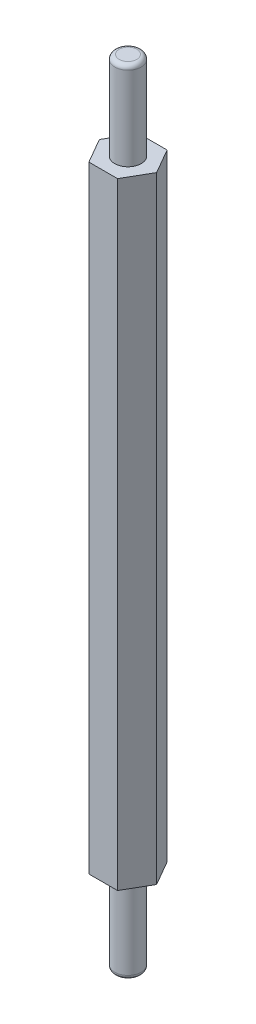
ISO-10303-21;
HEADER;
FILE_DESCRIPTION(('STEP AP214'),'2;1');
FILE_NAME('part.step','',(''),(''),'','','');
FILE_SCHEMA(('AUTOMOTIVE_DESIGN { 1 0 10303 214 1 1 1 1 }'));
ENDSEC;
DATA;
#1=APPLICATION_CONTEXT('core data for automotive mechanical design processes');
#2=APPLICATION_PROTOCOL_DEFINITION('international standard','automotive_design',2000,#1);
#3=PRODUCT_CONTEXT('',#1,'mechanical');
#4=PRODUCT('Part','Part','',(#3));
#5=PRODUCT_RELATED_PRODUCT_CATEGORY('part','',(#4));
#6=PRODUCT_DEFINITION_FORMATION('','',#4);
#7=PRODUCT_DEFINITION_CONTEXT('part definition',#1,'design');
#8=PRODUCT_DEFINITION('design','',#6,#7);
#9=PRODUCT_DEFINITION_SHAPE('','',#8);
#10=(LENGTH_UNIT() NAMED_UNIT(*) SI_UNIT(.MILLI.,.METRE.));
#11=(NAMED_UNIT(*) PLANE_ANGLE_UNIT() SI_UNIT($,.RADIAN.));
#12=(NAMED_UNIT(*) SI_UNIT($,.STERADIAN.) SOLID_ANGLE_UNIT());
#13=UNCERTAINTY_MEASURE_WITH_UNIT(LENGTH_MEASURE(1.E-05),#10,'distance_accuracy_value','');
#14=(GEOMETRIC_REPRESENTATION_CONTEXT(3) GLOBAL_UNCERTAINTY_ASSIGNED_CONTEXT((#13)) GLOBAL_UNIT_ASSIGNED_CONTEXT((#10,
#11,#12)) REPRESENTATION_CONTEXT('',''));
#15=CARTESIAN_POINT('',(0.,0.,0.));
#16=DIRECTION('',(0.,0.,1.));
#17=DIRECTION('',(1.,0.,0.));
#18=AXIS2_PLACEMENT_3D('',#15,#16,#17);
#19=CARTESIAN_POINT('',(0.,90.,0.));
#20=DIRECTION('',(0.,-1.,0.));
#21=DIRECTION('',(0.,0.,-1.));
#22=AXIS2_PLACEMENT_3D('',#19,#20,#21);
#23=CYLINDRICAL_SURFACE('',#22,1.5);
#24=CARTESIAN_POINT('',(0.,80.,0.));
#25=DIRECTION('',(0.,1.,0.));
#26=DIRECTION('',(0.,0.,1.));
#27=AXIS2_PLACEMENT_3D('',#24,#25,#26);
#28=CIRCLE('',#27,1.5);
#29=CARTESIAN_POINT('',(0.,80.,-1.5));
#30=VERTEX_POINT('',#29);
#31=EDGE_CURVE('E142',#30,#30,#28,.T.);
#32=CARTESIAN_POINT('',(0.,89.5,0.));
#33=DIRECTION('',(0.,1.,0.));
#34=DIRECTION('',(0.,0.,1.));
#35=AXIS2_PLACEMENT_3D('',#32,#33,#34);
#36=CIRCLE('',#35,1.5);
#37=CARTESIAN_POINT('',(0.,89.5,-1.5));
#38=VERTEX_POINT('',#37);
#39=EDGE_CURVE('E118',#38,#38,#36,.F.);
#40=CARTESIAN_POINT('',(0.,80.,-1.5));
#41=CARTESIAN_POINT('',(0.,80.0989583333333,-1.5));
#42=CARTESIAN_POINT('',(0.,80.1979166666667,-1.5));
#43=CARTESIAN_POINT('',(0.,80.3958333333333,-1.5));
#44=CARTESIAN_POINT('',(0.,80.4947916666667,-1.5));
#45=CARTESIAN_POINT('',(0.,80.6927083333333,-1.5));
#46=CARTESIAN_POINT('',(0.,80.7916666666667,-1.5));
#47=CARTESIAN_POINT('',(0.,80.9895833333333,-1.5));
#48=CARTESIAN_POINT('',(0.,81.0885416666667,-1.5));
#49=CARTESIAN_POINT('',(0.,81.2864583333333,-1.5));
#50=CARTESIAN_POINT('',(0.,81.3854166666667,-1.5));
#51=CARTESIAN_POINT('',(0.,81.5833333333333,-1.5));
#52=CARTESIAN_POINT('',(0.,81.6822916666667,-1.5));
#53=CARTESIAN_POINT('',(0.,81.8802083333333,-1.5));
#54=CARTESIAN_POINT('',(0.,81.9791666666667,-1.5));
#55=CARTESIAN_POINT('',(0.,82.1770833333333,-1.5));
#56=CARTESIAN_POINT('',(0.,82.2760416666667,-1.5));
#57=CARTESIAN_POINT('',(0.,82.4739583333333,-1.5));
#58=CARTESIAN_POINT('',(0.,82.5729166666667,-1.5));
#59=CARTESIAN_POINT('',(0.,82.7708333333333,-1.5));
#60=CARTESIAN_POINT('',(0.,82.8697916666667,-1.5));
#61=CARTESIAN_POINT('',(0.,83.0677083333333,-1.5));
#62=CARTESIAN_POINT('',(0.,83.1666666666667,-1.5));
#63=CARTESIAN_POINT('',(0.,83.3645833333333,-1.5));
#64=CARTESIAN_POINT('',(0.,83.4635416666667,-1.5));
#65=CARTESIAN_POINT('',(0.,83.6614583333333,-1.5));
#66=CARTESIAN_POINT('',(0.,83.7604166666667,-1.5));
#67=CARTESIAN_POINT('',(0.,83.9583333333333,-1.5));
#68=CARTESIAN_POINT('',(0.,84.0572916666667,-1.5));
#69=CARTESIAN_POINT('',(0.,84.2552083333333,-1.5));
#70=CARTESIAN_POINT('',(0.,84.3541666666667,-1.5));
#71=CARTESIAN_POINT('',(0.,84.5520833333333,-1.5));
#72=CARTESIAN_POINT('',(0.,84.6510416666667,-1.5));
#73=CARTESIAN_POINT('',(0.,84.8489583333333,-1.5));
#74=CARTESIAN_POINT('',(0.,84.9479166666667,-1.5));
#75=CARTESIAN_POINT('',(0.,85.1458333333333,-1.5));
#76=CARTESIAN_POINT('',(0.,85.2447916666667,-1.5));
#77=CARTESIAN_POINT('',(0.,85.4427083333333,-1.5));
#78=CARTESIAN_POINT('',(0.,85.5416666666667,-1.5));
#79=CARTESIAN_POINT('',(0.,85.7395833333333,-1.5));
#80=CARTESIAN_POINT('',(0.,85.8385416666667,-1.5));
#81=CARTESIAN_POINT('',(0.,86.0364583333333,-1.5));
#82=CARTESIAN_POINT('',(0.,86.1354166666667,-1.5));
#83=CARTESIAN_POINT('',(0.,86.3333333333333,-1.5));
#84=CARTESIAN_POINT('',(0.,86.4322916666667,-1.5));
#85=CARTESIAN_POINT('',(0.,86.6302083333333,-1.5));
#86=CARTESIAN_POINT('',(0.,86.7291666666667,-1.5));
#87=CARTESIAN_POINT('',(0.,86.9270833333333,-1.5));
#88=CARTESIAN_POINT('',(0.,87.0260416666667,-1.5));
#89=CARTESIAN_POINT('',(0.,87.2239583333333,-1.5));
#90=CARTESIAN_POINT('',(0.,87.3229166666667,-1.5));
#91=CARTESIAN_POINT('',(0.,87.5208333333333,-1.5));
#92=CARTESIAN_POINT('',(0.,87.6197916666667,-1.5));
#93=CARTESIAN_POINT('',(0.,87.8177083333333,-1.5));
#94=CARTESIAN_POINT('',(0.,87.9166666666667,-1.5));
#95=CARTESIAN_POINT('',(0.,88.1145833333333,-1.5));
#96=CARTESIAN_POINT('',(0.,88.2135416666667,-1.5));
#97=CARTESIAN_POINT('',(0.,88.4114583333333,-1.5));
#98=CARTESIAN_POINT('',(0.,88.5104166666667,-1.5));
#99=CARTESIAN_POINT('',(0.,88.7083333333333,-1.5));
#100=CARTESIAN_POINT('',(0.,88.8072916666667,-1.5));
#101=CARTESIAN_POINT('',(0.,89.0052083333333,-1.5));
#102=CARTESIAN_POINT('',(0.,89.1041666666667,-1.5));
#103=CARTESIAN_POINT('',(0.,89.3020833333333,-1.5));
#104=CARTESIAN_POINT('',(0.,89.4010416666667,-1.5));
#105=CARTESIAN_POINT('',(0.,89.5,-1.5));
#106=B_SPLINE_CURVE_WITH_KNOTS('',3,(#40,#41,#42,#43,#44,#45,#46,#47,#48,#49,#50,#51,#52,#53,
#54,#55,#56,#57,#58,#59,#60,#61,#62,#63,#64,#65,#66,#67,#68,#69,#70,#71,#72,#73,#74,#75,#76,#77,
#78,#79,#80,#81,#82,#83,#84,#85,#86,#87,#88,#89,#90,#91,#92,#93,#94,#95,#96,#97,#98,#99,#100,
#101,#102,#103,#104,#105),.UNSPECIFIED.,.F.,.F.,(4,2,2,2,2,2,2,2,2,2,2,2,2,2,2,2,2,2,2,2,2,2,2,
2,2,2,2,2,2,2,2,2,4),(0.,0.296874999999988,0.59374999999999,0.890624999999992,1.18749999999999,
1.484375,1.78125,2.078125,2.37499999999999,2.67187499999999,2.96874999999999,3.26562499999999,
3.5625,3.859375,4.15624999999999,4.45312499999999,4.74999999999999,5.04687499999999,
5.34374999999999,5.640625,5.93749999999998,6.23437499999999,6.53124999999999,6.82812499999999,
7.12499999999999,7.42187499999999,7.71874999999998,8.01562499999998,8.31249999999999,
8.60937499999999,8.90624999999999,9.20312499999999,9.49999999999999),.UNSPECIFIED.);
#107=EDGE_CURVE('BSEAM41',#30,#38,#106,.T.);
#108=ORIENTED_EDGE('',*,*,#31,.T.);
#109=ORIENTED_EDGE('',*,*,#39,.T.);
#110=ORIENTED_EDGE('',*,*,#107,.T.);
#111=ORIENTED_EDGE('',*,*,#107,.F.);
#112=EDGE_LOOP('',(#108,#110,#109,#111));
#113=FACE_BOUND('',#112,.T.);
#114=ADVANCED_FACE('F41',(#113),#23,.T.);
#115=CARTESIAN_POINT('',(0.,90.,0.));
#116=DIRECTION('',(0.,1.,0.));
#117=DIRECTION('',(0.,0.,1.));
#118=AXIS2_PLACEMENT_3D('',#115,#116,#117);
#119=PLANE('',#118);
#120=CARTESIAN_POINT('',(0.,90.,0.));
#121=DIRECTION('',(0.,1.,0.));
#122=DIRECTION('',(0.,0.,1.));
#123=AXIS2_PLACEMENT_3D('',#120,#121,#122);
#124=CIRCLE('',#123,1.);
#125=CARTESIAN_POINT('',(0.,90.,1.));
#126=VERTEX_POINT('',#125);
#127=EDGE_CURVE('E11',#126,#126,#124,.T.);
#128=ORIENTED_EDGE('',*,*,#127,.T.);
#129=EDGE_LOOP('',(#128));
#130=FACE_BOUND('',#129,.T.);
#131=ADVANCED_FACE('F210',(#130),#119,.T.);
#132=CARTESIAN_POINT('',(0.,89.5,0.));
#133=DIRECTION('',(0.,1.,0.));
#134=DIRECTION('',(0.,0.,1.));
#135=AXIS2_PLACEMENT_3D('',#132,#133,#134);
#136=TOROIDAL_SURFACE('',#135,1.,0.5);
#137=ORIENTED_EDGE('',*,*,#39,.F.);
#138=EDGE_LOOP('',(#137));
#139=FACE_BOUND('',#138,.T.);
#140=ORIENTED_EDGE('',*,*,#127,.F.);
#141=EDGE_LOOP('',(#140));
#142=FACE_BOUND('',#141,.T.);
#143=ADVANCED_FACE('F43',(#139,#142),#136,.T.);
#144=CARTESIAN_POINT('',(0.,80.,0.));
#145=DIRECTION('',(0.,1.,0.));
#146=DIRECTION('',(0.,0.,1.));
#147=AXIS2_PLACEMENT_3D('',#144,#145,#146);
#148=PLANE('',#147);
#149=DIRECTION('',(-1.,0.,0.));
#150=VECTOR('',#149,1.);
#151=CARTESIAN_POINT('',(1.62499999999999,80.,-2.81458256229941));
#152=LINE('',#151,#150);
#153=CARTESIAN_POINT('',(1.62499999999999,80.,-2.81458256229941));
#154=VERTEX_POINT('',#153);
#155=CARTESIAN_POINT('',(-1.62499999999999,80.,-2.81458256229941));
#156=VERTEX_POINT('',#155);
#157=EDGE_CURVE('E148',#154,#156,#152,.T.);
#158=ORIENTED_EDGE('',*,*,#157,.T.);
#159=DIRECTION('',(-0.5,0.,0.866025403784439));
#160=VECTOR('',#159,1.);
#161=CARTESIAN_POINT('',(-1.62499999999999,80.,-2.81458256229941));
#162=LINE('',#161,#160);
#163=CARTESIAN_POINT('',(-3.24999999999998,80.,0.));
#164=VERTEX_POINT('',#163);
#165=EDGE_CURVE('E116',#156,#164,#162,.T.);
#166=ORIENTED_EDGE('',*,*,#165,.T.);
#167=DIRECTION('',(0.5,0.,0.866025403784439));
#168=VECTOR('',#167,1.);
#169=CARTESIAN_POINT('',(-3.24999999999998,80.,0.));
#170=LINE('',#169,#168);
#171=CARTESIAN_POINT('',(-1.62499999999999,80.,2.81458256229941));
#172=VERTEX_POINT('',#171);
#173=EDGE_CURVE('E158',#164,#172,#170,.T.);
#174=ORIENTED_EDGE('',*,*,#173,.T.);
#175=DIRECTION('',(1.,0.,0.));
#176=VECTOR('',#175,1.);
#177=CARTESIAN_POINT('',(-1.62499999999999,80.,2.81458256229941));
#178=LINE('',#177,#176);
#179=CARTESIAN_POINT('',(1.62499999999999,80.,2.81458256229941));
#180=VERTEX_POINT('',#179);
#181=EDGE_CURVE('E161',#172,#180,#178,.T.);
#182=ORIENTED_EDGE('',*,*,#181,.T.);
#183=DIRECTION('',(0.5,0.,-0.866025403784438));
#184=VECTOR('',#183,1.);
#185=CARTESIAN_POINT('',(1.62499999999999,80.,2.81458256229941));
#186=LINE('',#185,#184);
#187=CARTESIAN_POINT('',(3.24999999999999,80.,0.));
#188=VERTEX_POINT('',#187);
#189=EDGE_CURVE('E164',#180,#188,#186,.T.);
#190=ORIENTED_EDGE('',*,*,#189,.T.);
#191=DIRECTION('',(-0.5,0.,-0.866025403784439));
#192=VECTOR('',#191,1.);
#193=CARTESIAN_POINT('',(3.24999999999999,80.,0.));
#194=LINE('',#193,#192);
#195=EDGE_CURVE('E65',#188,#154,#194,.T.);
#196=ORIENTED_EDGE('',*,*,#195,.T.);
#197=EDGE_LOOP('',(#158,#166,#174,#182,#190,#196));
#198=FACE_BOUND('',#197,.T.);
#199=ORIENTED_EDGE('',*,*,#31,.F.);
#200=EDGE_LOOP('',(#199));
#201=FACE_BOUND('',#200,.T.);
#202=ADVANCED_FACE('F202',(#198,#201),#148,.T.);
#203=CARTESIAN_POINT('',(1.62499999999999,80.,-2.81458256229941));
#204=DIRECTION('',(0.,0.,1.));
#205=DIRECTION('',(1.,0.,0.));
#206=AXIS2_PLACEMENT_3D('',#203,#204,#205);
#207=PLANE('',#206);
#208=DIRECTION('',(0.,-1.,0.));
#209=VECTOR('',#208,1.);
#210=CARTESIAN_POINT('',(1.62499999999999,80.,-2.81458256229941));
#211=LINE('',#210,#209);
#212=CARTESIAN_POINT('',(1.62499999999999,9.99999999999999,-2.81458256229941));
#213=VERTEX_POINT('',#212);
#214=EDGE_CURVE('E111',#154,#213,#211,.T.);
#215=ORIENTED_EDGE('',*,*,#214,.T.);
#216=DIRECTION('',(-1.,0.,0.));
#217=VECTOR('',#216,1.);
#218=CARTESIAN_POINT('',(1.62499999999999,10.,-2.81458256229941));
#219=LINE('',#218,#217);
#220=CARTESIAN_POINT('',(-1.62499999999999,10.,-2.81458256229941));
#221=VERTEX_POINT('',#220);
#222=EDGE_CURVE('E57',#213,#221,#219,.T.);
#223=ORIENTED_EDGE('',*,*,#222,.T.);
#224=DIRECTION('',(0.,-1.,0.));
#225=VECTOR('',#224,1.);
#226=CARTESIAN_POINT('',(-1.62499999999999,80.,-2.81458256229941));
#227=LINE('',#226,#225);
#228=EDGE_CURVE('E110',#156,#221,#227,.T.);
#229=ORIENTED_EDGE('',*,*,#228,.F.);
#230=ORIENTED_EDGE('',*,*,#157,.F.);
#231=EDGE_LOOP('',(#215,#223,#229,#230));
#232=FACE_BOUND('',#231,.T.);
#233=ADVANCED_FACE('F108',(#232),#207,.F.);
#234=CARTESIAN_POINT('',(-1.62499999999999,80.,-2.81458256229941));
#235=DIRECTION('',(0.866025403784439,0.,0.5));
#236=DIRECTION('',(0.5,0.,-0.866025403784439));
#237=AXIS2_PLACEMENT_3D('',#234,#235,#236);
#238=PLANE('',#237);
#239=ORIENTED_EDGE('',*,*,#228,.T.);
#240=DIRECTION('',(-0.5,0.,0.866025403784439));
#241=VECTOR('',#240,1.);
#242=CARTESIAN_POINT('',(-1.62499999999999,10.,-2.81458256229941));
#243=LINE('',#242,#241);
#244=CARTESIAN_POINT('',(-3.24999999999998,10.,0.));
#245=VERTEX_POINT('',#244);
#246=EDGE_CURVE('E94',#221,#245,#243,.T.);
#247=ORIENTED_EDGE('',*,*,#246,.T.);
#248=DIRECTION('',(0.,-1.,0.));
#249=VECTOR('',#248,1.);
#250=CARTESIAN_POINT('',(-3.24999999999998,80.,0.));
#251=LINE('',#250,#249);
#252=EDGE_CURVE('E119',#164,#245,#251,.T.);
#253=ORIENTED_EDGE('',*,*,#252,.F.);
#254=ORIENTED_EDGE('',*,*,#165,.F.);
#255=EDGE_LOOP('',(#239,#247,#253,#254));
#256=FACE_BOUND('',#255,.T.);
#257=ADVANCED_FACE('F115',(#256),#238,.F.);
#258=CARTESIAN_POINT('',(-3.24999999999998,80.,0.));
#259=DIRECTION('',(0.866025403784439,0.,-0.5));
#260=DIRECTION('',(-0.5,0.,-0.866025403784439));
#261=AXIS2_PLACEMENT_3D('',#258,#259,#260);
#262=PLANE('',#261);
#263=ORIENTED_EDGE('',*,*,#252,.T.);
#264=DIRECTION('',(0.5,0.,0.866025403784439));
#265=VECTOR('',#264,1.);
#266=CARTESIAN_POINT('',(-3.24999999999998,10.,0.));
#267=LINE('',#266,#265);
#268=CARTESIAN_POINT('',(-1.62499999999999,10.,2.81458256229941));
#269=VERTEX_POINT('',#268);
#270=EDGE_CURVE('E98',#245,#269,#267,.T.);
#271=ORIENTED_EDGE('',*,*,#270,.T.);
#272=DIRECTION('',(0.,-1.,0.));
#273=VECTOR('',#272,1.);
#274=CARTESIAN_POINT('',(-1.62499999999999,80.,2.81458256229941));
#275=LINE('',#274,#273);
#276=EDGE_CURVE('E125',#172,#269,#275,.T.);
#277=ORIENTED_EDGE('',*,*,#276,.F.);
#278=ORIENTED_EDGE('',*,*,#173,.F.);
#279=EDGE_LOOP('',(#263,#271,#277,#278));
#280=FACE_BOUND('',#279,.T.);
#281=ADVANCED_FACE('F189',(#280),#262,.F.);
#282=CARTESIAN_POINT('',(-1.62499999999999,80.,2.81458256229941));
#283=DIRECTION('',(0.,0.,-1.));
#284=DIRECTION('',(-1.,0.,0.));
#285=AXIS2_PLACEMENT_3D('',#282,#283,#284);
#286=PLANE('',#285);
#287=ORIENTED_EDGE('',*,*,#276,.T.);
#288=DIRECTION('',(1.,0.,0.));
#289=VECTOR('',#288,1.);
#290=CARTESIAN_POINT('',(-1.62499999999999,10.,2.81458256229941));
#291=LINE('',#290,#289);
#292=CARTESIAN_POINT('',(1.62499999999999,10.,2.81458256229941));
#293=VERTEX_POINT('',#292);
#294=EDGE_CURVE('E186',#269,#293,#291,.T.);
#295=ORIENTED_EDGE('',*,*,#294,.T.);
#296=DIRECTION('',(0.,-1.,0.));
#297=VECTOR('',#296,1.);
#298=CARTESIAN_POINT('',(1.62499999999999,80.,2.81458256229941));
#299=LINE('',#298,#297);
#300=EDGE_CURVE('E175',#180,#293,#299,.T.);
#301=ORIENTED_EDGE('',*,*,#300,.F.);
#302=ORIENTED_EDGE('',*,*,#181,.F.);
#303=EDGE_LOOP('',(#287,#295,#301,#302));
#304=FACE_BOUND('',#303,.T.);
#305=ADVANCED_FACE('F184',(#304),#286,.F.);
#306=CARTESIAN_POINT('',(1.62499999999999,80.,2.81458256229941));
#307=DIRECTION('',(-0.866025403784438,0.,-0.5));
#308=DIRECTION('',(-0.5,0.,0.866025403784439));
#309=AXIS2_PLACEMENT_3D('',#306,#307,#308);
#310=PLANE('',#309);
#311=ORIENTED_EDGE('',*,*,#300,.T.);
#312=DIRECTION('',(0.5,0.,-0.866025403784438));
#313=VECTOR('',#312,1.);
#314=CARTESIAN_POINT('',(1.62499999999999,10.,2.81458256229941));
#315=LINE('',#314,#313);
#316=CARTESIAN_POINT('',(3.24999999999999,10.,0.));
#317=VERTEX_POINT('',#316);
#318=EDGE_CURVE('E150',#293,#317,#315,.T.);
#319=ORIENTED_EDGE('',*,*,#318,.T.);
#320=DIRECTION('',(0.,-1.,0.));
#321=VECTOR('',#320,1.);
#322=CARTESIAN_POINT('',(3.24999999999999,80.,0.));
#323=LINE('',#322,#321);
#324=EDGE_CURVE('E171',#188,#317,#323,.T.);
#325=ORIENTED_EDGE('',*,*,#324,.F.);
#326=ORIENTED_EDGE('',*,*,#189,.F.);
#327=EDGE_LOOP('',(#311,#319,#325,#326));
#328=FACE_BOUND('',#327,.T.);
#329=ADVANCED_FACE('F198',(#328),#310,.F.);
#330=CARTESIAN_POINT('',(3.24999999999999,80.,0.));
#331=DIRECTION('',(-0.866025403784439,0.,0.5));
#332=DIRECTION('',(0.5,0.,0.866025403784439));
#333=AXIS2_PLACEMENT_3D('',#330,#331,#332);
#334=PLANE('',#333);
#335=ORIENTED_EDGE('',*,*,#324,.T.);
#336=DIRECTION('',(-0.5,0.,-0.866025403784439));
#337=VECTOR('',#336,1.);
#338=CARTESIAN_POINT('',(3.24999999999999,10.,0.));
#339=LINE('',#338,#337);
#340=EDGE_CURVE('E143',#317,#213,#339,.T.);
#341=ORIENTED_EDGE('',*,*,#340,.T.);
#342=ORIENTED_EDGE('',*,*,#214,.F.);
#343=ORIENTED_EDGE('',*,*,#195,.F.);
#344=EDGE_LOOP('',(#335,#341,#342,#343));
#345=FACE_BOUND('',#344,.T.);
#346=ADVANCED_FACE('F201',(#345),#334,.F.);
#347=CARTESIAN_POINT('',(0.,10.,0.));
#348=DIRECTION('',(0.,-1.,0.));
#349=DIRECTION('',(0.,0.,-1.));
#350=AXIS2_PLACEMENT_3D('',#347,#348,#349);
#351=CYLINDRICAL_SURFACE('',#350,1.5);
#352=CARTESIAN_POINT('',(0.,10.,0.));
#353=DIRECTION('',(0.,1.,0.));
#354=DIRECTION('',(0.,0.,1.));
#355=AXIS2_PLACEMENT_3D('',#352,#353,#354);
#356=CIRCLE('',#355,1.5);
#357=CARTESIAN_POINT('',(0.,10.,1.5));
#358=VERTEX_POINT('',#357);
#359=EDGE_CURVE('E113',#358,#358,#356,.T.);
#360=ORIENTED_EDGE('',*,*,#359,.F.);
#361=EDGE_LOOP('',(#360));
#362=FACE_BOUND('',#361,.T.);
#363=CARTESIAN_POINT('',(0.,0.5,0.));
#364=DIRECTION('',(0.,-1.,0.));
#365=DIRECTION('',(0.,0.,-1.));
#366=AXIS2_PLACEMENT_3D('',#363,#364,#365);
#367=CIRCLE('',#366,1.5);
#368=CARTESIAN_POINT('',(0.,0.5,-1.5));
#369=VERTEX_POINT('',#368);
#370=EDGE_CURVE('E139',#369,#369,#367,.T.);
#371=ORIENTED_EDGE('',*,*,#370,.F.);
#372=EDGE_LOOP('',(#371));
#373=FACE_BOUND('',#372,.T.);
#374=ADVANCED_FACE('F229',(#362,#373),#351,.T.);
#375=CARTESIAN_POINT('',(0.,10.,0.));
#376=DIRECTION('',(0.,1.,0.));
#377=DIRECTION('',(0.,0.,1.));
#378=AXIS2_PLACEMENT_3D('',#375,#376,#377);
#379=PLANE('',#378);
#380=ORIENTED_EDGE('',*,*,#222,.F.);
#381=ORIENTED_EDGE('',*,*,#340,.F.);
#382=ORIENTED_EDGE('',*,*,#318,.F.);
#383=ORIENTED_EDGE('',*,*,#294,.F.);
#384=ORIENTED_EDGE('',*,*,#270,.F.);
#385=ORIENTED_EDGE('',*,*,#246,.F.);
#386=EDGE_LOOP('',(#380,#381,#382,#383,#384,#385));
#387=FACE_BOUND('',#386,.T.);
#388=ORIENTED_EDGE('',*,*,#359,.T.);
#389=EDGE_LOOP('',(#388));
#390=FACE_BOUND('',#389,.T.);
#391=ADVANCED_FACE('F95',(#387,#390),#379,.F.);
#392=CARTESIAN_POINT('',(0.,0.,0.));
#393=DIRECTION('',(0.,1.,0.));
#394=DIRECTION('',(0.,0.,1.));
#395=AXIS2_PLACEMENT_3D('',#392,#393,#394);
#396=PLANE('',#395);
#397=CARTESIAN_POINT('',(0.,0.,0.));
#398=DIRECTION('',(0.,1.,0.));
#399=DIRECTION('',(0.,0.,1.));
#400=AXIS2_PLACEMENT_3D('',#397,#398,#399);
#401=CIRCLE('',#400,1.);
#402=CARTESIAN_POINT('',(0.,0.,1.));
#403=VERTEX_POINT('',#402);
#404=EDGE_CURVE('E50',#403,#403,#401,.F.);
#405=ORIENTED_EDGE('',*,*,#404,.T.);
#406=EDGE_LOOP('',(#405));
#407=FACE_BOUND('',#406,.T.);
#408=ADVANCED_FACE('F132',(#407),#396,.F.);
#409=CARTESIAN_POINT('',(0.,0.5,0.));
#410=DIRECTION('',(0.,1.,0.));
#411=DIRECTION('',(0.,0.,1.));
#412=AXIS2_PLACEMENT_3D('',#409,#410,#411);
#413=TOROIDAL_SURFACE('',#412,1.,0.5);
#414=ORIENTED_EDGE('',*,*,#404,.F.);
#415=EDGE_LOOP('',(#414));
#416=FACE_BOUND('',#415,.T.);
#417=ORIENTED_EDGE('',*,*,#370,.T.);
#418=EDGE_LOOP('',(#417));
#419=FACE_BOUND('',#418,.T.);
#420=ADVANCED_FACE('F134',(#416,#419),#413,.T.);
#421=CLOSED_SHELL('',(#114,#131,#143,#202,#233,#257,#281,#305,#329,#346,#374,#391,#408,#420));
#422=MANIFOLD_SOLID_BREP('B2',#421);
#423=ADVANCED_BREP_SHAPE_REPRESENTATION('',(#18,#422),#14);
#424=SHAPE_DEFINITION_REPRESENTATION(#9,#423);
ENDSEC;
END-ISO-10303-21;
